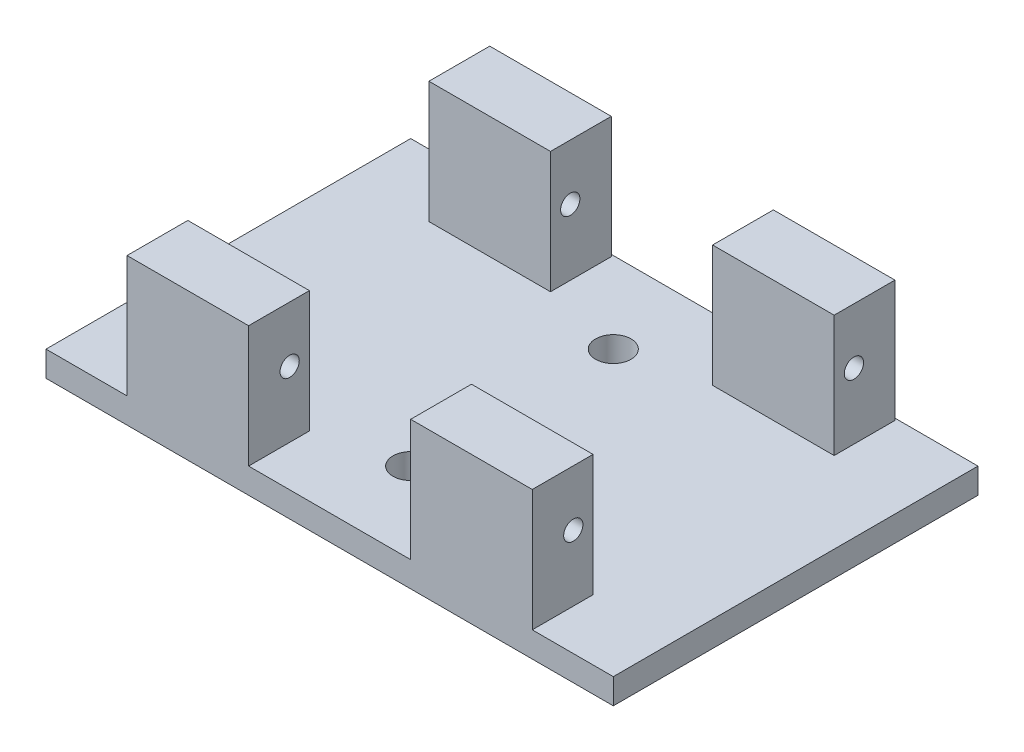
ISO-10303-21;
HEADER;
FILE_DESCRIPTION(('STEP AP214'),'2;1');
FILE_NAME('part.step','',(''),(''),'','','');
FILE_SCHEMA(('AUTOMOTIVE_DESIGN { 1 0 10303 214 1 1 1 1 }'));
ENDSEC;
DATA;
#1=APPLICATION_CONTEXT('core data for automotive mechanical design processes');
#2=APPLICATION_PROTOCOL_DEFINITION('international standard','automotive_design',2000,#1);
#3=PRODUCT_CONTEXT('',#1,'mechanical');
#4=PRODUCT('Part','Part','',(#3));
#5=PRODUCT_RELATED_PRODUCT_CATEGORY('part','',(#4));
#6=PRODUCT_DEFINITION_FORMATION('','',#4);
#7=PRODUCT_DEFINITION_CONTEXT('part definition',#1,'design');
#8=PRODUCT_DEFINITION('design','',#6,#7);
#9=PRODUCT_DEFINITION_SHAPE('','',#8);
#10=(LENGTH_UNIT() NAMED_UNIT(*) SI_UNIT(.MILLI.,.METRE.));
#11=(NAMED_UNIT(*) PLANE_ANGLE_UNIT() SI_UNIT($,.RADIAN.));
#12=(NAMED_UNIT(*) SI_UNIT($,.STERADIAN.) SOLID_ANGLE_UNIT());
#13=UNCERTAINTY_MEASURE_WITH_UNIT(LENGTH_MEASURE(1.E-05),#10,'distance_accuracy_value','');
#14=(GEOMETRIC_REPRESENTATION_CONTEXT(3) GLOBAL_UNCERTAINTY_ASSIGNED_CONTEXT((#13)) GLOBAL_UNIT_ASSIGNED_CONTEXT((#10,
#11,#12)) REPRESENTATION_CONTEXT('',''));
#15=CARTESIAN_POINT('',(0.,0.,0.));
#16=DIRECTION('',(0.,0.,1.));
#17=DIRECTION('',(1.,0.,0.));
#18=AXIS2_PLACEMENT_3D('',#15,#16,#17);
#19=CARTESIAN_POINT('',(0.,2.5,0.));
#20=DIRECTION('',(0.,1.,0.));
#21=DIRECTION('',(0.,0.,1.));
#22=AXIS2_PLACEMENT_3D('',#19,#20,#21);
#23=PLANE('',#22);
#24=CARTESIAN_POINT('',(0.,2.5,10.));
#25=DIRECTION('',(0.,1.,0.));
#26=DIRECTION('',(0.,0.,1.));
#27=AXIS2_PLACEMENT_3D('',#24,#25,#26);
#28=CIRCLE('',#27,1.75);
#29=CARTESIAN_POINT('',(0.,2.5,11.75));
#30=VERTEX_POINT('',#29);
#31=EDGE_CURVE('E691',#30,#30,#28,.T.);
#32=ORIENTED_EDGE('',*,*,#31,.F.);
#33=EDGE_LOOP('',(#32));
#34=FACE_BOUND('',#33,.T.);
#35=CARTESIAN_POINT('',(0.,2.5,-10.));
#36=DIRECTION('',(0.,1.,0.));
#37=DIRECTION('',(0.,0.,1.));
#38=AXIS2_PLACEMENT_3D('',#35,#36,#37);
#39=CIRCLE('',#38,1.75);
#40=CARTESIAN_POINT('',(0.,2.5,-8.25));
#41=VERTEX_POINT('',#40);
#42=EDGE_CURVE('E692',#41,#41,#39,.T.);
#43=ORIENTED_EDGE('',*,*,#42,.F.);
#44=EDGE_LOOP('',(#43));
#45=FACE_BOUND('',#44,.T.);
#46=DIRECTION('',(0.,0.,1.));
#47=VECTOR('',#46,1.);
#48=CARTESIAN_POINT('',(-8.,2.5,-17.8));
#49=LINE('',#48,#47);
#50=CARTESIAN_POINT('',(-8.,2.5,-17.8));
#51=VERTEX_POINT('',#50);
#52=CARTESIAN_POINT('',(-8.,2.5,-11.8));
#53=VERTEX_POINT('',#52);
#54=EDGE_CURVE('E183',#51,#53,#49,.T.);
#55=ORIENTED_EDGE('',*,*,#54,.T.);
#56=DIRECTION('',(-1.,0.,0.));
#57=VECTOR('',#56,1.);
#58=CARTESIAN_POINT('',(-8.,2.5,-11.8));
#59=LINE('',#58,#57);
#60=CARTESIAN_POINT('',(-20.,2.5,-11.8));
#61=VERTEX_POINT('',#60);
#62=EDGE_CURVE('E197',#53,#61,#59,.T.);
#63=ORIENTED_EDGE('',*,*,#62,.T.);
#64=DIRECTION('',(0.,0.,-1.));
#65=VECTOR('',#64,1.);
#66=CARTESIAN_POINT('',(-20.,2.5,-17.8));
#67=LINE('',#66,#65);
#68=CARTESIAN_POINT('',(-20.,2.5,-17.8));
#69=VERTEX_POINT('',#68);
#70=EDGE_CURVE('E61',#61,#69,#67,.T.);
#71=ORIENTED_EDGE('',*,*,#70,.T.);
#72=DIRECTION('',(1.,0.,0.));
#73=VECTOR('',#72,1.);
#74=CARTESIAN_POINT('',(-8.,2.5,-17.8));
#75=LINE('',#74,#73);
#76=EDGE_CURVE('E56',#69,#51,#75,.T.);
#77=ORIENTED_EDGE('',*,*,#76,.T.);
#78=EDGE_LOOP('',(#55,#63,#71,#77));
#79=FACE_BOUND('',#78,.T.);
#80=DIRECTION('',(0.,0.,1.));
#81=VECTOR('',#80,1.);
#82=CARTESIAN_POINT('',(-8.,2.5,12.));
#83=LINE('',#82,#81);
#84=CARTESIAN_POINT('',(-8.,2.5,12.));
#85=VERTEX_POINT('',#84);
#86=CARTESIAN_POINT('',(-8.,2.5,18.));
#87=VERTEX_POINT('',#86);
#88=EDGE_CURVE('E231',#85,#87,#83,.T.);
#89=ORIENTED_EDGE('',*,*,#88,.T.);
#90=DIRECTION('',(1.,0.,0.));
#91=VECTOR('',#90,1.);
#92=CARTESIAN_POINT('',(-28.,2.5,18.));
#93=LINE('',#92,#91);
#94=CARTESIAN_POINT('',(7.99999999999999,2.5,18.));
#95=VERTEX_POINT('',#94);
#96=EDGE_CURVE('E331',#87,#95,#93,.T.);
#97=ORIENTED_EDGE('',*,*,#96,.T.);
#98=DIRECTION('',(0.,0.,1.));
#99=VECTOR('',#98,1.);
#100=CARTESIAN_POINT('',(8.,2.5,12.));
#101=LINE('',#100,#99);
#102=CARTESIAN_POINT('',(8.,2.5,12.));
#103=VERTEX_POINT('',#102);
#104=EDGE_CURVE('E275',#103,#95,#101,.T.);
#105=ORIENTED_EDGE('',*,*,#104,.F.);
#106=DIRECTION('',(-1.,0.,0.));
#107=VECTOR('',#106,1.);
#108=CARTESIAN_POINT('',(8.,2.5,12.));
#109=LINE('',#108,#107);
#110=CARTESIAN_POINT('',(20.,2.5,12.));
#111=VERTEX_POINT('',#110);
#112=EDGE_CURVE('E303',#111,#103,#109,.T.);
#113=ORIENTED_EDGE('',*,*,#112,.F.);
#114=DIRECTION('',(0.,0.,-1.));
#115=VECTOR('',#114,1.);
#116=CARTESIAN_POINT('',(20.,2.5,12.));
#117=LINE('',#116,#115);
#118=CARTESIAN_POINT('',(20.,2.5,18.));
#119=VERTEX_POINT('',#118);
#120=EDGE_CURVE('E306',#119,#111,#117,.T.);
#121=ORIENTED_EDGE('',*,*,#120,.F.);
#122=CARTESIAN_POINT('',(28.,2.5,18.));
#123=VERTEX_POINT('',#122);
#124=EDGE_CURVE('E327',#119,#123,#93,.T.);
#125=ORIENTED_EDGE('',*,*,#124,.T.);
#126=DIRECTION('',(0.,0.,-1.));
#127=VECTOR('',#126,1.);
#128=CARTESIAN_POINT('',(28.,2.5,-18.));
#129=LINE('',#128,#127);
#130=CARTESIAN_POINT('',(28.,2.5,-18.));
#131=VERTEX_POINT('',#130);
#132=EDGE_CURVE('E319',#123,#131,#129,.T.);
#133=ORIENTED_EDGE('',*,*,#132,.T.);
#134=DIRECTION('',(-1.,0.,0.));
#135=VECTOR('',#134,1.);
#136=CARTESIAN_POINT('',(-28.,2.5,-18.));
#137=LINE('',#136,#135);
#138=CARTESIAN_POINT('',(-28.,2.5,-18.));
#139=VERTEX_POINT('',#138);
#140=EDGE_CURVE('E322',#131,#139,#137,.T.);
#141=ORIENTED_EDGE('',*,*,#140,.T.);
#142=DIRECTION('',(0.,0.,1.));
#143=VECTOR('',#142,1.);
#144=CARTESIAN_POINT('',(-28.,2.5,-18.));
#145=LINE('',#144,#143);
#146=CARTESIAN_POINT('',(-28.,2.5,18.));
#147=VERTEX_POINT('',#146);
#148=EDGE_CURVE('E325',#139,#147,#145,.T.);
#149=ORIENTED_EDGE('',*,*,#148,.T.);
#150=CARTESIAN_POINT('',(-20.,2.5,18.));
#151=VERTEX_POINT('',#150);
#152=EDGE_CURVE('E328',#147,#151,#93,.T.);
#153=ORIENTED_EDGE('',*,*,#152,.T.);
#154=DIRECTION('',(0.,0.,-1.));
#155=VECTOR('',#154,1.);
#156=CARTESIAN_POINT('',(-20.,2.5,12.));
#157=LINE('',#156,#155);
#158=CARTESIAN_POINT('',(-20.,2.5,12.));
#159=VERTEX_POINT('',#158);
#160=EDGE_CURVE('E221',#151,#159,#157,.T.);
#161=ORIENTED_EDGE('',*,*,#160,.T.);
#162=DIRECTION('',(1.,0.,0.));
#163=VECTOR('',#162,1.);
#164=CARTESIAN_POINT('',(-8.,2.5,12.));
#165=LINE('',#164,#163);
#166=EDGE_CURVE('E234',#159,#85,#165,.T.);
#167=ORIENTED_EDGE('',*,*,#166,.T.);
#168=EDGE_LOOP('',(#89,#97,#105,#113,#121,#125,#133,#141,#149,#153,#161,#167));
#169=FACE_BOUND('',#168,.T.);
#170=DIRECTION('',(1.,0.,0.));
#171=VECTOR('',#170,1.);
#172=CARTESIAN_POINT('',(8.,2.5,-11.8));
#173=LINE('',#172,#171);
#174=CARTESIAN_POINT('',(8.,2.5,-11.8));
#175=VERTEX_POINT('',#174);
#176=CARTESIAN_POINT('',(20.,2.5,-11.8));
#177=VERTEX_POINT('',#176);
#178=EDGE_CURVE('E274',#175,#177,#173,.T.);
#179=ORIENTED_EDGE('',*,*,#178,.F.);
#180=DIRECTION('',(0.,0.,1.));
#181=VECTOR('',#180,1.);
#182=CARTESIAN_POINT('',(8.,2.5,-17.8));
#183=LINE('',#182,#181);
#184=CARTESIAN_POINT('',(8.,2.5,-17.8));
#185=VERTEX_POINT('',#184);
#186=EDGE_CURVE('E271',#185,#175,#183,.T.);
#187=ORIENTED_EDGE('',*,*,#186,.F.);
#188=DIRECTION('',(-1.,0.,0.));
#189=VECTOR('',#188,1.);
#190=CARTESIAN_POINT('',(8.,2.5,-17.8));
#191=LINE('',#190,#189);
#192=CARTESIAN_POINT('',(20.,2.5,-17.8));
#193=VERTEX_POINT('',#192);
#194=EDGE_CURVE('E264',#193,#185,#191,.T.);
#195=ORIENTED_EDGE('',*,*,#194,.F.);
#196=DIRECTION('',(0.,0.,-1.));
#197=VECTOR('',#196,1.);
#198=CARTESIAN_POINT('',(20.,2.5,-17.8));
#199=LINE('',#198,#197);
#200=EDGE_CURVE('E277',#177,#193,#199,.T.);
#201=ORIENTED_EDGE('',*,*,#200,.F.);
#202=EDGE_LOOP('',(#179,#187,#195,#201));
#203=FACE_BOUND('',#202,.T.);
#204=ADVANCED_FACE('F41',(#34,#45,#79,#169,#203),#23,.T.);
#205=CARTESIAN_POINT('',(28.,2.5,-18.));
#206=DIRECTION('',(-1.,0.,0.));
#207=DIRECTION('',(0.,0.,1.));
#208=AXIS2_PLACEMENT_3D('',#205,#206,#207);
#209=PLANE('',#208);
#210=DIRECTION('',(0.,0.,-1.));
#211=VECTOR('',#210,1.);
#212=CARTESIAN_POINT('',(28.,0.,-18.));
#213=LINE('',#212,#211);
#214=CARTESIAN_POINT('',(28.,0.,18.));
#215=VERTEX_POINT('',#214);
#216=CARTESIAN_POINT('',(28.,0.,-18.));
#217=VERTEX_POINT('',#216);
#218=EDGE_CURVE('E290',#215,#217,#213,.T.);
#219=ORIENTED_EDGE('',*,*,#218,.T.);
#220=DIRECTION('',(0.,-1.,0.));
#221=VECTOR('',#220,1.);
#222=CARTESIAN_POINT('',(28.,2.5,-18.));
#223=LINE('',#222,#221);
#224=EDGE_CURVE('E11',#131,#217,#223,.T.);
#225=ORIENTED_EDGE('',*,*,#224,.F.);
#226=ORIENTED_EDGE('',*,*,#132,.F.);
#227=DIRECTION('',(0.,-1.,0.));
#228=VECTOR('',#227,1.);
#229=CARTESIAN_POINT('',(28.,2.5,18.));
#230=LINE('',#229,#228);
#231=EDGE_CURVE('E330',#123,#215,#230,.T.);
#232=ORIENTED_EDGE('',*,*,#231,.T.);
#233=EDGE_LOOP('',(#219,#225,#226,#232));
#234=FACE_BOUND('',#233,.T.);
#235=ADVANCED_FACE('F43',(#234),#209,.F.);
#236=CARTESIAN_POINT('',(-28.,2.5,-18.));
#237=DIRECTION('',(0.,0.,1.));
#238=DIRECTION('',(1.,0.,0.));
#239=AXIS2_PLACEMENT_3D('',#236,#237,#238);
#240=PLANE('',#239);
#241=DIRECTION('',(-1.,0.,0.));
#242=VECTOR('',#241,1.);
#243=CARTESIAN_POINT('',(-28.,0.,-18.));
#244=LINE('',#243,#242);
#245=CARTESIAN_POINT('',(-28.,0.,-18.));
#246=VERTEX_POINT('',#245);
#247=EDGE_CURVE('E334',#217,#246,#244,.T.);
#248=ORIENTED_EDGE('',*,*,#247,.T.);
#249=DIRECTION('',(0.,-1.,0.));
#250=VECTOR('',#249,1.);
#251=CARTESIAN_POINT('',(-28.,2.5,-18.));
#252=LINE('',#251,#250);
#253=EDGE_CURVE('E49',#139,#246,#252,.T.);
#254=ORIENTED_EDGE('',*,*,#253,.F.);
#255=ORIENTED_EDGE('',*,*,#140,.F.);
#256=ORIENTED_EDGE('',*,*,#224,.T.);
#257=EDGE_LOOP('',(#248,#254,#255,#256));
#258=FACE_BOUND('',#257,.T.);
#259=ADVANCED_FACE('F401',(#258),#240,.F.);
#260=CARTESIAN_POINT('',(-28.,2.5,-18.));
#261=DIRECTION('',(1.,0.,0.));
#262=DIRECTION('',(0.,0.,-1.));
#263=AXIS2_PLACEMENT_3D('',#260,#261,#262);
#264=PLANE('',#263);
#265=DIRECTION('',(0.,0.,1.));
#266=VECTOR('',#265,1.);
#267=CARTESIAN_POINT('',(-28.,0.,-18.));
#268=LINE('',#267,#266);
#269=CARTESIAN_POINT('',(-28.,0.,18.));
#270=VERTEX_POINT('',#269);
#271=EDGE_CURVE('E336',#246,#270,#268,.T.);
#272=ORIENTED_EDGE('',*,*,#271,.T.);
#273=DIRECTION('',(0.,-1.,0.));
#274=VECTOR('',#273,1.);
#275=CARTESIAN_POINT('',(-28.,2.5,18.));
#276=LINE('',#275,#274);
#277=EDGE_CURVE('E341',#147,#270,#276,.T.);
#278=ORIENTED_EDGE('',*,*,#277,.F.);
#279=ORIENTED_EDGE('',*,*,#148,.F.);
#280=ORIENTED_EDGE('',*,*,#253,.T.);
#281=EDGE_LOOP('',(#272,#278,#279,#280));
#282=FACE_BOUND('',#281,.T.);
#283=ADVANCED_FACE('F348',(#282),#264,.F.);
#284=CARTESIAN_POINT('',(-28.,2.5,18.));
#285=DIRECTION('',(0.,0.,-1.));
#286=DIRECTION('',(-1.,0.,0.));
#287=AXIS2_PLACEMENT_3D('',#284,#285,#286);
#288=PLANE('',#287);
#289=DIRECTION('',(1.,0.,0.));
#290=VECTOR('',#289,1.);
#291=CARTESIAN_POINT('',(-28.,0.,18.));
#292=LINE('',#291,#290);
#293=EDGE_CURVE('E323',#270,#215,#292,.T.);
#294=ORIENTED_EDGE('',*,*,#293,.T.);
#295=ORIENTED_EDGE('',*,*,#231,.F.);
#296=ORIENTED_EDGE('',*,*,#124,.F.);
#297=DIRECTION('',(0.,-1.,0.));
#298=VECTOR('',#297,1.);
#299=CARTESIAN_POINT('',(20.,14.5,18.));
#300=LINE('',#299,#298);
#301=CARTESIAN_POINT('',(20.,14.5,18.));
#302=VERTEX_POINT('',#301);
#303=EDGE_CURVE('E293',#302,#119,#300,.T.);
#304=ORIENTED_EDGE('',*,*,#303,.F.);
#305=DIRECTION('',(1.,0.,0.));
#306=VECTOR('',#305,1.);
#307=CARTESIAN_POINT('',(8.,14.5,18.));
#308=LINE('',#307,#306);
#309=CARTESIAN_POINT('',(8.,14.5,18.));
#310=VERTEX_POINT('',#309);
#311=EDGE_CURVE('E315',#310,#302,#308,.T.);
#312=ORIENTED_EDGE('',*,*,#311,.F.);
#313=DIRECTION('',(0.,-1.,0.));
#314=VECTOR('',#313,1.);
#315=CARTESIAN_POINT('',(8.,14.5,18.));
#316=LINE('',#315,#314);
#317=EDGE_CURVE('E259',#310,#95,#316,.T.);
#318=ORIENTED_EDGE('',*,*,#317,.T.);
#319=ORIENTED_EDGE('',*,*,#96,.F.);
#320=DIRECTION('',(0.,-1.,0.));
#321=VECTOR('',#320,1.);
#322=CARTESIAN_POINT('',(-8.,14.5,18.));
#323=LINE('',#322,#321);
#324=CARTESIAN_POINT('',(-8.,14.5,18.));
#325=VERTEX_POINT('',#324);
#326=EDGE_CURVE('E230',#325,#87,#323,.T.);
#327=ORIENTED_EDGE('',*,*,#326,.F.);
#328=DIRECTION('',(-1.,0.,0.));
#329=VECTOR('',#328,1.);
#330=CARTESIAN_POINT('',(-8.,14.5,18.));
#331=LINE('',#330,#329);
#332=CARTESIAN_POINT('',(-20.,14.5,18.));
#333=VERTEX_POINT('',#332);
#334=EDGE_CURVE('E227',#325,#333,#331,.T.);
#335=ORIENTED_EDGE('',*,*,#334,.T.);
#336=DIRECTION('',(0.,-1.,0.));
#337=VECTOR('',#336,1.);
#338=CARTESIAN_POINT('',(-20.,14.5,18.));
#339=LINE('',#338,#337);
#340=EDGE_CURVE('E240',#333,#151,#339,.T.);
#341=ORIENTED_EDGE('',*,*,#340,.T.);
#342=ORIENTED_EDGE('',*,*,#152,.F.);
#343=ORIENTED_EDGE('',*,*,#277,.T.);
#344=EDGE_LOOP('',(#294,#295,#296,#304,#312,#318,#319,#327,#335,#341,#342,#343));
#345=FACE_BOUND('',#344,.T.);
#346=ADVANCED_FACE('F357',(#345),#288,.F.);
#347=CARTESIAN_POINT('',(0.,0.,0.));
#348=DIRECTION('',(0.,1.,0.));
#349=DIRECTION('',(0.,0.,1.));
#350=AXIS2_PLACEMENT_3D('',#347,#348,#349);
#351=PLANE('',#350);
#352=CARTESIAN_POINT('',(0.,0.,10.));
#353=DIRECTION('',(0.,1.,0.));
#354=DIRECTION('',(0.,0.,1.));
#355=AXIS2_PLACEMENT_3D('',#352,#353,#354);
#356=CIRCLE('',#355,1.75);
#357=CARTESIAN_POINT('',(0.,0.,11.75));
#358=VERTEX_POINT('',#357);
#359=EDGE_CURVE('E689',#358,#358,#356,.T.);
#360=ORIENTED_EDGE('',*,*,#359,.T.);
#361=EDGE_LOOP('',(#360));
#362=FACE_BOUND('',#361,.T.);
#363=CARTESIAN_POINT('',(0.,0.,-10.));
#364=DIRECTION('',(0.,1.,0.));
#365=DIRECTION('',(0.,0.,1.));
#366=AXIS2_PLACEMENT_3D('',#363,#364,#365);
#367=CIRCLE('',#366,1.75);
#368=CARTESIAN_POINT('',(0.,0.,-8.25));
#369=VERTEX_POINT('',#368);
#370=EDGE_CURVE('E697',#369,#369,#367,.T.);
#371=ORIENTED_EDGE('',*,*,#370,.T.);
#372=EDGE_LOOP('',(#371));
#373=FACE_BOUND('',#372,.T.);
#374=ORIENTED_EDGE('',*,*,#218,.F.);
#375=ORIENTED_EDGE('',*,*,#293,.F.);
#376=ORIENTED_EDGE('',*,*,#271,.F.);
#377=ORIENTED_EDGE('',*,*,#247,.F.);
#378=EDGE_LOOP('',(#374,#375,#376,#377));
#379=FACE_BOUND('',#378,.T.);
#380=ADVANCED_FACE('F354',(#362,#373,#379),#351,.F.);
#381=CARTESIAN_POINT('',(8.,14.5,-17.8));
#382=DIRECTION('',(1.,0.,0.));
#383=DIRECTION('',(0.,0.,-1.));
#384=AXIS2_PLACEMENT_3D('',#381,#382,#383);
#385=PLANE('',#384);
#386=CARTESIAN_POINT('',(8.,9.,-13.75));
#387=DIRECTION('',(1.,0.,0.));
#388=DIRECTION('',(0.,0.,-1.));
#389=AXIS2_PLACEMENT_3D('',#386,#387,#388);
#390=CIRCLE('',#389,0.949999999999999);
#391=CARTESIAN_POINT('',(8.,9.,-14.7));
#392=VERTEX_POINT('',#391);
#393=EDGE_CURVE('E256',#392,#392,#390,.T.);
#394=ORIENTED_EDGE('',*,*,#393,.T.);
#395=EDGE_LOOP('',(#394));
#396=FACE_BOUND('',#395,.T.);
#397=ORIENTED_EDGE('',*,*,#186,.T.);
#398=DIRECTION('',(0.,-1.,0.));
#399=VECTOR('',#398,1.);
#400=CARTESIAN_POINT('',(8.,14.5,-11.8));
#401=LINE('',#400,#399);
#402=CARTESIAN_POINT('',(8.,14.5,-11.8));
#403=VERTEX_POINT('',#402);
#404=EDGE_CURVE('E288',#403,#175,#401,.T.);
#405=ORIENTED_EDGE('',*,*,#404,.F.);
#406=DIRECTION('',(0.,0.,1.));
#407=VECTOR('',#406,1.);
#408=CARTESIAN_POINT('',(8.,14.5,-17.8));
#409=LINE('',#408,#407);
#410=CARTESIAN_POINT('',(8.,14.5,-17.8));
#411=VERTEX_POINT('',#410);
#412=EDGE_CURVE('E260',#411,#403,#409,.T.);
#413=ORIENTED_EDGE('',*,*,#412,.F.);
#414=DIRECTION('',(0.,-1.,0.));
#415=VECTOR('',#414,1.);
#416=CARTESIAN_POINT('',(8.,14.5,-17.8));
#417=LINE('',#416,#415);
#418=EDGE_CURVE('E270',#411,#185,#417,.T.);
#419=ORIENTED_EDGE('',*,*,#418,.T.);
#420=EDGE_LOOP('',(#397,#405,#413,#419));
#421=FACE_BOUND('',#420,.T.);
#422=ADVANCED_FACE('F406',(#396,#421),#385,.F.);
#423=CARTESIAN_POINT('',(8.,14.5,-11.8));
#424=DIRECTION('',(0.,0.,-1.));
#425=DIRECTION('',(-1.,0.,0.));
#426=AXIS2_PLACEMENT_3D('',#423,#424,#425);
#427=PLANE('',#426);
#428=ORIENTED_EDGE('',*,*,#178,.T.);
#429=DIRECTION('',(0.,-1.,0.));
#430=VECTOR('',#429,1.);
#431=CARTESIAN_POINT('',(20.,14.5,-11.8));
#432=LINE('',#431,#430);
#433=CARTESIAN_POINT('',(20.,14.5,-11.8));
#434=VERTEX_POINT('',#433);
#435=EDGE_CURVE('E285',#434,#177,#432,.T.);
#436=ORIENTED_EDGE('',*,*,#435,.F.);
#437=DIRECTION('',(1.,0.,0.));
#438=VECTOR('',#437,1.);
#439=CARTESIAN_POINT('',(8.,14.5,-11.8));
#440=LINE('',#439,#438);
#441=EDGE_CURVE('E263',#403,#434,#440,.T.);
#442=ORIENTED_EDGE('',*,*,#441,.F.);
#443=ORIENTED_EDGE('',*,*,#404,.T.);
#444=EDGE_LOOP('',(#428,#436,#442,#443));
#445=FACE_BOUND('',#444,.T.);
#446=ADVANCED_FACE('F426',(#445),#427,.F.);
#447=CARTESIAN_POINT('',(20.,14.5,-17.8));
#448=DIRECTION('',(-1.,0.,0.));
#449=DIRECTION('',(0.,0.,1.));
#450=AXIS2_PLACEMENT_3D('',#447,#448,#449);
#451=PLANE('',#450);
#452=CARTESIAN_POINT('',(20.,9.,-13.75));
#453=DIRECTION('',(1.,0.,0.));
#454=DIRECTION('',(0.,0.,-1.));
#455=AXIS2_PLACEMENT_3D('',#452,#453,#454);
#456=CIRCLE('',#455,0.949999999999999);
#457=CARTESIAN_POINT('',(20.,9.,-14.7));
#458=VERTEX_POINT('',#457);
#459=EDGE_CURVE('E186',#458,#458,#456,.T.);
#460=ORIENTED_EDGE('',*,*,#459,.F.);
#461=EDGE_LOOP('',(#460));
#462=FACE_BOUND('',#461,.T.);
#463=ORIENTED_EDGE('',*,*,#200,.T.);
#464=DIRECTION('',(0.,-1.,0.));
#465=VECTOR('',#464,1.);
#466=CARTESIAN_POINT('',(20.,14.5,-17.8));
#467=LINE('',#466,#465);
#468=CARTESIAN_POINT('',(20.,14.5,-17.8));
#469=VERTEX_POINT('',#468);
#470=EDGE_CURVE('E283',#469,#193,#467,.T.);
#471=ORIENTED_EDGE('',*,*,#470,.F.);
#472=DIRECTION('',(0.,0.,-1.));
#473=VECTOR('',#472,1.);
#474=CARTESIAN_POINT('',(20.,14.5,-17.8));
#475=LINE('',#474,#473);
#476=EDGE_CURVE('E266',#434,#469,#475,.T.);
#477=ORIENTED_EDGE('',*,*,#476,.F.);
#478=ORIENTED_EDGE('',*,*,#435,.T.);
#479=EDGE_LOOP('',(#463,#471,#477,#478));
#480=FACE_BOUND('',#479,.T.);
#481=ADVANCED_FACE('F430',(#462,#480),#451,.F.);
#482=CARTESIAN_POINT('',(8.,14.5,-17.8));
#483=DIRECTION('',(0.,0.,1.));
#484=DIRECTION('',(1.,0.,0.));
#485=AXIS2_PLACEMENT_3D('',#482,#483,#484);
#486=PLANE('',#485);
#487=ORIENTED_EDGE('',*,*,#194,.T.);
#488=ORIENTED_EDGE('',*,*,#418,.F.);
#489=DIRECTION('',(-1.,0.,0.));
#490=VECTOR('',#489,1.);
#491=CARTESIAN_POINT('',(8.,14.5,-17.8));
#492=LINE('',#491,#490);
#493=EDGE_CURVE('E268',#469,#411,#492,.T.);
#494=ORIENTED_EDGE('',*,*,#493,.F.);
#495=ORIENTED_EDGE('',*,*,#470,.T.);
#496=EDGE_LOOP('',(#487,#488,#494,#495));
#497=FACE_BOUND('',#496,.T.);
#498=ADVANCED_FACE('F438',(#497),#486,.F.);
#499=CARTESIAN_POINT('',(0.,14.5,0.));
#500=DIRECTION('',(0.,1.,0.));
#501=DIRECTION('',(0.,0.,1.));
#502=AXIS2_PLACEMENT_3D('',#499,#500,#501);
#503=PLANE('',#502);
#504=ORIENTED_EDGE('',*,*,#412,.T.);
#505=ORIENTED_EDGE('',*,*,#441,.T.);
#506=ORIENTED_EDGE('',*,*,#476,.T.);
#507=ORIENTED_EDGE('',*,*,#493,.T.);
#508=EDGE_LOOP('',(#504,#505,#506,#507));
#509=FACE_BOUND('',#508,.T.);
#510=ADVANCED_FACE('F442',(#509),#503,.T.);
#511=CARTESIAN_POINT('',(8.,14.5,12.));
#512=DIRECTION('',(1.,0.,0.));
#513=DIRECTION('',(0.,0.,-1.));
#514=AXIS2_PLACEMENT_3D('',#511,#512,#513);
#515=PLANE('',#514);
#516=CARTESIAN_POINT('',(8.,9.,13.95));
#517=DIRECTION('',(1.,0.,0.));
#518=DIRECTION('',(0.,0.,-1.));
#519=AXIS2_PLACEMENT_3D('',#516,#517,#518);
#520=CIRCLE('',#519,0.949999999999999);
#521=CARTESIAN_POINT('',(8.,9.,13.));
#522=VERTEX_POINT('',#521);
#523=EDGE_CURVE('E251',#522,#522,#520,.T.);
#524=ORIENTED_EDGE('',*,*,#523,.T.);
#525=EDGE_LOOP('',(#524));
#526=FACE_BOUND('',#525,.T.);
#527=ORIENTED_EDGE('',*,*,#104,.T.);
#528=ORIENTED_EDGE('',*,*,#317,.F.);
#529=DIRECTION('',(0.,0.,1.));
#530=VECTOR('',#529,1.);
#531=CARTESIAN_POINT('',(8.,14.5,12.));
#532=LINE('',#531,#530);
#533=CARTESIAN_POINT('',(8.,14.5,12.));
#534=VERTEX_POINT('',#533);
#535=EDGE_CURVE('E307',#534,#310,#532,.T.);
#536=ORIENTED_EDGE('',*,*,#535,.F.);
#537=DIRECTION('',(0.,-1.,0.));
#538=VECTOR('',#537,1.);
#539=CARTESIAN_POINT('',(8.,14.5,12.));
#540=LINE('',#539,#538);
#541=EDGE_CURVE('E299',#534,#103,#540,.T.);
#542=ORIENTED_EDGE('',*,*,#541,.T.);
#543=EDGE_LOOP('',(#527,#528,#536,#542));
#544=FACE_BOUND('',#543,.T.);
#545=ADVANCED_FACE('F370',(#526,#544),#515,.F.);
#546=CARTESIAN_POINT('',(20.,14.5,12.));
#547=DIRECTION('',(-1.,0.,0.));
#548=DIRECTION('',(0.,0.,1.));
#549=AXIS2_PLACEMENT_3D('',#546,#547,#548);
#550=PLANE('',#549);
#551=CARTESIAN_POINT('',(20.,9.,13.95));
#552=DIRECTION('',(1.,0.,0.));
#553=DIRECTION('',(0.,0.,-1.));
#554=AXIS2_PLACEMENT_3D('',#551,#552,#553);
#555=CIRCLE('',#554,0.949999999999999);
#556=CARTESIAN_POINT('',(20.,9.,13.));
#557=VERTEX_POINT('',#556);
#558=EDGE_CURVE('E248',#557,#557,#555,.T.);
#559=ORIENTED_EDGE('',*,*,#558,.F.);
#560=EDGE_LOOP('',(#559));
#561=FACE_BOUND('',#560,.T.);
#562=ORIENTED_EDGE('',*,*,#120,.T.);
#563=DIRECTION('',(0.,-1.,0.));
#564=VECTOR('',#563,1.);
#565=CARTESIAN_POINT('',(20.,14.5,12.));
#566=LINE('',#565,#564);
#567=CARTESIAN_POINT('',(20.,14.5,12.));
#568=VERTEX_POINT('',#567);
#569=EDGE_CURVE('E296',#568,#111,#566,.T.);
#570=ORIENTED_EDGE('',*,*,#569,.F.);
#571=DIRECTION('',(0.,0.,-1.));
#572=VECTOR('',#571,1.);
#573=CARTESIAN_POINT('',(20.,14.5,12.));
#574=LINE('',#573,#572);
#575=EDGE_CURVE('E313',#302,#568,#574,.T.);
#576=ORIENTED_EDGE('',*,*,#575,.F.);
#577=ORIENTED_EDGE('',*,*,#303,.T.);
#578=EDGE_LOOP('',(#562,#570,#576,#577));
#579=FACE_BOUND('',#578,.T.);
#580=ADVANCED_FACE('F377',(#561,#579),#550,.F.);
#581=CARTESIAN_POINT('',(8.,14.5,12.));
#582=DIRECTION('',(0.,0.,1.));
#583=DIRECTION('',(1.,0.,0.));
#584=AXIS2_PLACEMENT_3D('',#581,#582,#583);
#585=PLANE('',#584);
#586=ORIENTED_EDGE('',*,*,#112,.T.);
#587=ORIENTED_EDGE('',*,*,#541,.F.);
#588=DIRECTION('',(-1.,0.,0.));
#589=VECTOR('',#588,1.);
#590=CARTESIAN_POINT('',(8.,14.5,12.));
#591=LINE('',#590,#589);
#592=EDGE_CURVE('E302',#568,#534,#591,.T.);
#593=ORIENTED_EDGE('',*,*,#592,.F.);
#594=ORIENTED_EDGE('',*,*,#569,.T.);
#595=EDGE_LOOP('',(#586,#587,#593,#594));
#596=FACE_BOUND('',#595,.T.);
#597=ADVANCED_FACE('F374',(#596),#585,.F.);
#598=CARTESIAN_POINT('',(0.,14.5,0.));
#599=DIRECTION('',(0.,1.,0.));
#600=DIRECTION('',(0.,0.,1.));
#601=AXIS2_PLACEMENT_3D('',#598,#599,#600);
#602=PLANE('',#601);
#603=ORIENTED_EDGE('',*,*,#535,.T.);
#604=ORIENTED_EDGE('',*,*,#311,.T.);
#605=ORIENTED_EDGE('',*,*,#575,.T.);
#606=ORIENTED_EDGE('',*,*,#592,.T.);
#607=EDGE_LOOP('',(#603,#604,#605,#606));
#608=FACE_BOUND('',#607,.T.);
#609=ADVANCED_FACE('F380',(#608),#602,.T.);
#610=CARTESIAN_POINT('',(-28.,9.,13.95));
#611=DIRECTION('',(1.,0.,0.));
#612=DIRECTION('',(0.,0.,-1.));
#613=AXIS2_PLACEMENT_3D('',#610,#611,#612);
#614=CYLINDRICAL_SURFACE('',#613,0.949999999999999);
#615=ORIENTED_EDGE('',*,*,#558,.T.);
#616=EDGE_LOOP('',(#615));
#617=FACE_BOUND('',#616,.T.);
#618=ORIENTED_EDGE('',*,*,#523,.F.);
#619=EDGE_LOOP('',(#618));
#620=FACE_BOUND('',#619,.T.);
#621=ADVANCED_FACE('F382',(#617,#620),#614,.F.);
#622=CARTESIAN_POINT('',(-28.,9.,-13.75));
#623=DIRECTION('',(1.,0.,0.));
#624=DIRECTION('',(0.,0.,-1.));
#625=AXIS2_PLACEMENT_3D('',#622,#623,#624);
#626=CYLINDRICAL_SURFACE('',#625,0.949999999999999);
#627=ORIENTED_EDGE('',*,*,#459,.T.);
#628=EDGE_LOOP('',(#627));
#629=FACE_BOUND('',#628,.T.);
#630=ORIENTED_EDGE('',*,*,#393,.F.);
#631=EDGE_LOOP('',(#630));
#632=FACE_BOUND('',#631,.T.);
#633=ADVANCED_FACE('F389',(#629,#632),#626,.F.);
#634=CARTESIAN_POINT('',(-8.,14.5,12.));
#635=DIRECTION('',(1.,0.,0.));
#636=DIRECTION('',(0.,0.,-1.));
#637=AXIS2_PLACEMENT_3D('',#634,#635,#636);
#638=PLANE('',#637);
#639=CARTESIAN_POINT('',(-7.99999999999999,9.,13.95));
#640=DIRECTION('',(1.,0.,0.));
#641=DIRECTION('',(0.,0.,-1.));
#642=AXIS2_PLACEMENT_3D('',#639,#640,#641);
#643=CIRCLE('',#642,0.949999999999999);
#644=CARTESIAN_POINT('',(-7.99999999999999,9.,13.));
#645=VERTEX_POINT('',#644);
#646=EDGE_CURVE('E235',#645,#645,#643,.F.);
#647=ORIENTED_EDGE('',*,*,#646,.T.);
#648=EDGE_LOOP('',(#647));
#649=FACE_BOUND('',#648,.T.);
#650=ORIENTED_EDGE('',*,*,#88,.F.);
#651=DIRECTION('',(0.,-1.,0.));
#652=VECTOR('',#651,1.);
#653=CARTESIAN_POINT('',(-8.,14.5,12.));
#654=LINE('',#653,#652);
#655=CARTESIAN_POINT('',(-8.,14.5,12.));
#656=VERTEX_POINT('',#655);
#657=EDGE_CURVE('E208',#656,#85,#654,.T.);
#658=ORIENTED_EDGE('',*,*,#657,.F.);
#659=DIRECTION('',(0.,0.,1.));
#660=VECTOR('',#659,1.);
#661=CARTESIAN_POINT('',(-8.,14.5,12.));
#662=LINE('',#661,#660);
#663=EDGE_CURVE('E217',#656,#325,#662,.T.);
#664=ORIENTED_EDGE('',*,*,#663,.T.);
#665=ORIENTED_EDGE('',*,*,#326,.T.);
#666=EDGE_LOOP('',(#650,#658,#664,#665));
#667=FACE_BOUND('',#666,.T.);
#668=ADVANCED_FACE('F483',(#649,#667),#638,.T.);
#669=CARTESIAN_POINT('',(-8.,14.5,12.));
#670=DIRECTION('',(0.,0.,-1.));
#671=DIRECTION('',(-1.,0.,0.));
#672=AXIS2_PLACEMENT_3D('',#669,#670,#671);
#673=PLANE('',#672);
#674=ORIENTED_EDGE('',*,*,#166,.F.);
#675=DIRECTION('',(0.,-1.,0.));
#676=VECTOR('',#675,1.);
#677=CARTESIAN_POINT('',(-20.,14.5,12.));
#678=LINE('',#677,#676);
#679=CARTESIAN_POINT('',(-20.,14.5,12.));
#680=VERTEX_POINT('',#679);
#681=EDGE_CURVE('E243',#680,#159,#678,.T.);
#682=ORIENTED_EDGE('',*,*,#681,.F.);
#683=DIRECTION('',(1.,0.,0.));
#684=VECTOR('',#683,1.);
#685=CARTESIAN_POINT('',(-8.,14.5,12.));
#686=LINE('',#685,#684);
#687=EDGE_CURVE('E220',#680,#656,#686,.T.);
#688=ORIENTED_EDGE('',*,*,#687,.T.);
#689=ORIENTED_EDGE('',*,*,#657,.T.);
#690=EDGE_LOOP('',(#674,#682,#688,#689));
#691=FACE_BOUND('',#690,.T.);
#692=ADVANCED_FACE('F501',(#691),#673,.T.);
#693=CARTESIAN_POINT('',(-20.,14.5,12.));
#694=DIRECTION('',(-1.,0.,0.));
#695=DIRECTION('',(0.,0.,1.));
#696=AXIS2_PLACEMENT_3D('',#693,#694,#695);
#697=PLANE('',#696);
#698=CARTESIAN_POINT('',(-20.,9.,13.95));
#699=DIRECTION('',(1.,0.,0.));
#700=DIRECTION('',(0.,0.,-1.));
#701=AXIS2_PLACEMENT_3D('',#698,#699,#700);
#702=CIRCLE('',#701,0.949999999999999);
#703=CARTESIAN_POINT('',(-20.,9.,13.));
#704=VERTEX_POINT('',#703);
#705=EDGE_CURVE('E702',#704,#704,#702,.T.);
#706=ORIENTED_EDGE('',*,*,#705,.T.);
#707=EDGE_LOOP('',(#706));
#708=FACE_BOUND('',#707,.T.);
#709=ORIENTED_EDGE('',*,*,#160,.F.);
#710=ORIENTED_EDGE('',*,*,#340,.F.);
#711=DIRECTION('',(0.,0.,-1.));
#712=VECTOR('',#711,1.);
#713=CARTESIAN_POINT('',(-20.,14.5,12.));
#714=LINE('',#713,#712);
#715=EDGE_CURVE('E224',#333,#680,#714,.T.);
#716=ORIENTED_EDGE('',*,*,#715,.T.);
#717=ORIENTED_EDGE('',*,*,#681,.T.);
#718=EDGE_LOOP('',(#709,#710,#716,#717));
#719=FACE_BOUND('',#718,.T.);
#720=ADVANCED_FACE('F511',(#708,#719),#697,.T.);
#721=CARTESIAN_POINT('',(0.,14.5,0.));
#722=DIRECTION('',(0.,1.,0.));
#723=DIRECTION('',(0.,0.,1.));
#724=AXIS2_PLACEMENT_3D('',#721,#722,#723);
#725=PLANE('',#724);
#726=ORIENTED_EDGE('',*,*,#663,.F.);
#727=ORIENTED_EDGE('',*,*,#687,.F.);
#728=ORIENTED_EDGE('',*,*,#715,.F.);
#729=ORIENTED_EDGE('',*,*,#334,.F.);
#730=EDGE_LOOP('',(#726,#727,#728,#729));
#731=FACE_BOUND('',#730,.T.);
#732=ADVANCED_FACE('F521',(#731),#725,.T.);
#733=CARTESIAN_POINT('',(-8.,14.5,-17.8));
#734=DIRECTION('',(1.,0.,0.));
#735=DIRECTION('',(0.,0.,-1.));
#736=AXIS2_PLACEMENT_3D('',#733,#734,#735);
#737=PLANE('',#736);
#738=CARTESIAN_POINT('',(-7.99999999999999,9.,-13.75));
#739=DIRECTION('',(1.,0.,0.));
#740=DIRECTION('',(0.,0.,-1.));
#741=AXIS2_PLACEMENT_3D('',#738,#739,#740);
#742=CIRCLE('',#741,0.949999999999999);
#743=CARTESIAN_POINT('',(-7.99999999999999,9.,-14.7));
#744=VERTEX_POINT('',#743);
#745=EDGE_CURVE('E705',#744,#744,#742,.F.);
#746=ORIENTED_EDGE('',*,*,#745,.T.);
#747=EDGE_LOOP('',(#746));
#748=FACE_BOUND('',#747,.T.);
#749=ORIENTED_EDGE('',*,*,#54,.F.);
#750=DIRECTION('',(0.,-1.,0.));
#751=VECTOR('',#750,1.);
#752=CARTESIAN_POINT('',(-8.,14.5,-17.8));
#753=LINE('',#752,#751);
#754=CARTESIAN_POINT('',(-8.,14.5,-17.8));
#755=VERTEX_POINT('',#754);
#756=EDGE_CURVE('E177',#755,#51,#753,.T.);
#757=ORIENTED_EDGE('',*,*,#756,.F.);
#758=DIRECTION('',(0.,0.,1.));
#759=VECTOR('',#758,1.);
#760=CARTESIAN_POINT('',(-8.,14.5,-17.8));
#761=LINE('',#760,#759);
#762=CARTESIAN_POINT('',(-8.,14.5,-11.8));
#763=VERTEX_POINT('',#762);
#764=EDGE_CURVE('E181',#755,#763,#761,.T.);
#765=ORIENTED_EDGE('',*,*,#764,.T.);
#766=DIRECTION('',(0.,-1.,0.));
#767=VECTOR('',#766,1.);
#768=CARTESIAN_POINT('',(-8.,14.5,-11.8));
#769=LINE('',#768,#767);
#770=EDGE_CURVE('E206',#763,#53,#769,.T.);
#771=ORIENTED_EDGE('',*,*,#770,.T.);
#772=EDGE_LOOP('',(#749,#757,#765,#771));
#773=FACE_BOUND('',#772,.T.);
#774=ADVANCED_FACE('F179',(#748,#773),#737,.T.);
#775=CARTESIAN_POINT('',(-8.,14.5,-17.8));
#776=DIRECTION('',(0.,0.,-1.));
#777=DIRECTION('',(-1.,0.,0.));
#778=AXIS2_PLACEMENT_3D('',#775,#776,#777);
#779=PLANE('',#778);
#780=ORIENTED_EDGE('',*,*,#76,.F.);
#781=DIRECTION('',(0.,-1.,0.));
#782=VECTOR('',#781,1.);
#783=CARTESIAN_POINT('',(-20.,14.5,-17.8));
#784=LINE('',#783,#782);
#785=CARTESIAN_POINT('',(-20.,14.5,-17.8));
#786=VERTEX_POINT('',#785);
#787=EDGE_CURVE('E187',#786,#69,#784,.T.);
#788=ORIENTED_EDGE('',*,*,#787,.F.);
#789=DIRECTION('',(1.,0.,0.));
#790=VECTOR('',#789,1.);
#791=CARTESIAN_POINT('',(-8.,14.5,-17.8));
#792=LINE('',#791,#790);
#793=EDGE_CURVE('E193',#786,#755,#792,.T.);
#794=ORIENTED_EDGE('',*,*,#793,.T.);
#795=ORIENTED_EDGE('',*,*,#756,.T.);
#796=EDGE_LOOP('',(#780,#788,#794,#795));
#797=FACE_BOUND('',#796,.T.);
#798=ADVANCED_FACE('F199',(#797),#779,.T.);
#799=CARTESIAN_POINT('',(-20.,14.5,-17.8));
#800=DIRECTION('',(-1.,0.,0.));
#801=DIRECTION('',(0.,0.,1.));
#802=AXIS2_PLACEMENT_3D('',#799,#800,#801);
#803=PLANE('',#802);
#804=CARTESIAN_POINT('',(-20.,9.,-13.75));
#805=DIRECTION('',(1.,0.,0.));
#806=DIRECTION('',(0.,0.,-1.));
#807=AXIS2_PLACEMENT_3D('',#804,#805,#806);
#808=CIRCLE('',#807,0.949999999999999);
#809=CARTESIAN_POINT('',(-20.,9.,-14.7));
#810=VERTEX_POINT('',#809);
#811=EDGE_CURVE('E694',#810,#810,#808,.T.);
#812=ORIENTED_EDGE('',*,*,#811,.T.);
#813=EDGE_LOOP('',(#812));
#814=FACE_BOUND('',#813,.T.);
#815=ORIENTED_EDGE('',*,*,#70,.F.);
#816=DIRECTION('',(0.,-1.,0.));
#817=VECTOR('',#816,1.);
#818=CARTESIAN_POINT('',(-20.,14.5,-11.8));
#819=LINE('',#818,#817);
#820=CARTESIAN_POINT('',(-20.,14.5,-11.8));
#821=VERTEX_POINT('',#820);
#822=EDGE_CURVE('E213',#821,#61,#819,.T.);
#823=ORIENTED_EDGE('',*,*,#822,.F.);
#824=DIRECTION('',(0.,0.,-1.));
#825=VECTOR('',#824,1.);
#826=CARTESIAN_POINT('',(-20.,14.5,-17.8));
#827=LINE('',#826,#825);
#828=EDGE_CURVE('E200',#821,#786,#827,.T.);
#829=ORIENTED_EDGE('',*,*,#828,.T.);
#830=ORIENTED_EDGE('',*,*,#787,.T.);
#831=EDGE_LOOP('',(#815,#823,#829,#830));
#832=FACE_BOUND('',#831,.T.);
#833=ADVANCED_FACE('F549',(#814,#832),#803,.T.);
#834=CARTESIAN_POINT('',(-8.,14.5,-11.8));
#835=DIRECTION('',(0.,0.,1.));
#836=DIRECTION('',(1.,0.,0.));
#837=AXIS2_PLACEMENT_3D('',#834,#835,#836);
#838=PLANE('',#837);
#839=ORIENTED_EDGE('',*,*,#62,.F.);
#840=ORIENTED_EDGE('',*,*,#770,.F.);
#841=DIRECTION('',(-1.,0.,0.));
#842=VECTOR('',#841,1.);
#843=CARTESIAN_POINT('',(-8.,14.5,-11.8));
#844=LINE('',#843,#842);
#845=EDGE_CURVE('E196',#763,#821,#844,.T.);
#846=ORIENTED_EDGE('',*,*,#845,.T.);
#847=ORIENTED_EDGE('',*,*,#822,.T.);
#848=EDGE_LOOP('',(#839,#840,#846,#847));
#849=FACE_BOUND('',#848,.T.);
#850=ADVANCED_FACE('F558',(#849),#838,.T.);
#851=CARTESIAN_POINT('',(0.,14.5,0.));
#852=DIRECTION('',(0.,1.,0.));
#853=DIRECTION('',(0.,0.,1.));
#854=AXIS2_PLACEMENT_3D('',#851,#852,#853);
#855=PLANE('',#854);
#856=ORIENTED_EDGE('',*,*,#764,.F.);
#857=ORIENTED_EDGE('',*,*,#793,.F.);
#858=ORIENTED_EDGE('',*,*,#828,.F.);
#859=ORIENTED_EDGE('',*,*,#845,.F.);
#860=EDGE_LOOP('',(#856,#857,#858,#859));
#861=FACE_BOUND('',#860,.T.);
#862=ADVANCED_FACE('F191',(#861),#855,.T.);
#863=CARTESIAN_POINT('',(28.,9.,-13.75));
#864=DIRECTION('',(-1.,0.,0.));
#865=DIRECTION('',(0.,0.,1.));
#866=AXIS2_PLACEMENT_3D('',#863,#864,#865);
#867=CYLINDRICAL_SURFACE('',#866,0.949999999999999);
#868=ORIENTED_EDGE('',*,*,#745,.F.);
#869=EDGE_LOOP('',(#868));
#870=FACE_BOUND('',#869,.T.);
#871=ORIENTED_EDGE('',*,*,#811,.F.);
#872=EDGE_LOOP('',(#871));
#873=FACE_BOUND('',#872,.T.);
#874=ADVANCED_FACE('F577',(#870,#873),#867,.F.);
#875=CARTESIAN_POINT('',(28.,9.,13.95));
#876=DIRECTION('',(-1.,0.,0.));
#877=DIRECTION('',(0.,0.,1.));
#878=AXIS2_PLACEMENT_3D('',#875,#876,#877);
#879=CYLINDRICAL_SURFACE('',#878,0.949999999999999);
#880=ORIENTED_EDGE('',*,*,#646,.F.);
#881=EDGE_LOOP('',(#880));
#882=FACE_BOUND('',#881,.T.);
#883=ORIENTED_EDGE('',*,*,#705,.F.);
#884=EDGE_LOOP('',(#883));
#885=FACE_BOUND('',#884,.T.);
#886=ADVANCED_FACE('F586',(#882,#885),#879,.F.);
#887=CARTESIAN_POINT('',(0.,0.,-10.));
#888=DIRECTION('',(0.,1.,0.));
#889=DIRECTION('',(0.,0.,1.));
#890=AXIS2_PLACEMENT_3D('',#887,#888,#889);
#891=CYLINDRICAL_SURFACE('',#890,1.75);
#892=ORIENTED_EDGE('',*,*,#370,.F.);
#893=EDGE_LOOP('',(#892));
#894=FACE_BOUND('',#893,.T.);
#895=ORIENTED_EDGE('',*,*,#42,.T.);
#896=EDGE_LOOP('',(#895));
#897=FACE_BOUND('',#896,.T.);
#898=ADVANCED_FACE('F595',(#894,#897),#891,.F.);
#899=CARTESIAN_POINT('',(0.,0.,10.));
#900=DIRECTION('',(0.,1.,0.));
#901=DIRECTION('',(0.,0.,1.));
#902=AXIS2_PLACEMENT_3D('',#899,#900,#901);
#903=CYLINDRICAL_SURFACE('',#902,1.75);
#904=ORIENTED_EDGE('',*,*,#359,.F.);
#905=EDGE_LOOP('',(#904));
#906=FACE_BOUND('',#905,.T.);
#907=ORIENTED_EDGE('',*,*,#31,.T.);
#908=EDGE_LOOP('',(#907));
#909=FACE_BOUND('',#908,.T.);
#910=ADVANCED_FACE('F605',(#906,#909),#903,.F.);
#911=CLOSED_SHELL('',(#204,#235,#259,#283,#346,#380,#422,#446,#481,#498,#510,#545,#580,#597,
#609,#621,#633,#668,#692,#720,#732,#774,#798,#833,#850,#862,#874,#886,#898,#910));
#912=MANIFOLD_SOLID_BREP('B2',#911);
#913=ADVANCED_BREP_SHAPE_REPRESENTATION('',(#18,#912),#14);
#914=SHAPE_DEFINITION_REPRESENTATION(#9,#913);
ENDSEC;
END-ISO-10303-21;
